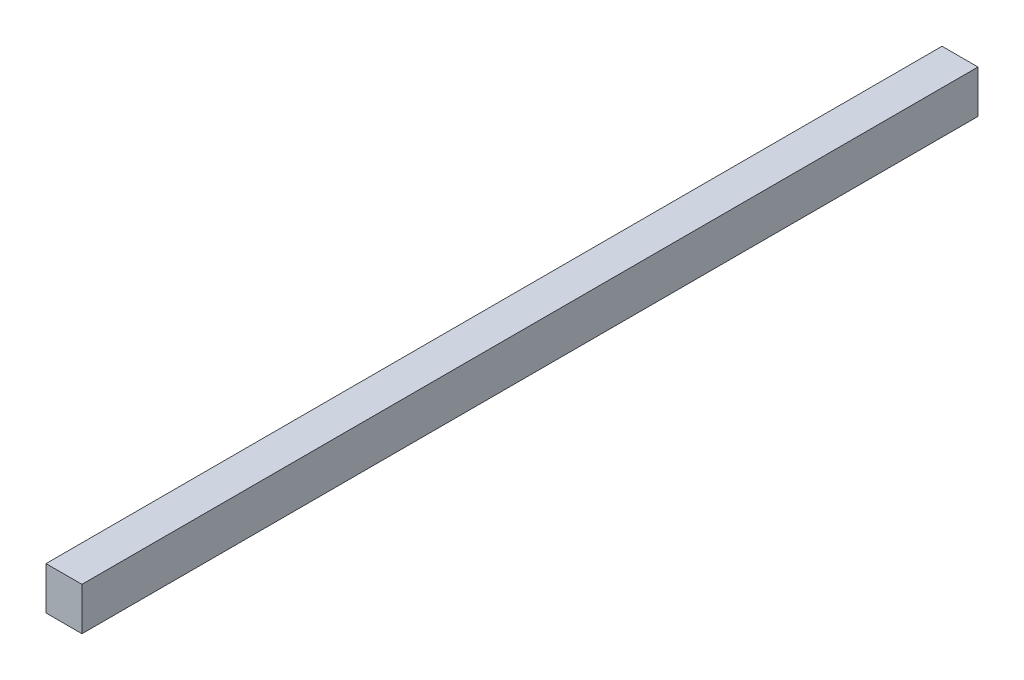
ISO-10303-21;
HEADER;
FILE_DESCRIPTION(('STEP AP214'),'2;1');
FILE_NAME('part.step','',(''),(''),'','','');
FILE_SCHEMA(('AUTOMOTIVE_DESIGN { 1 0 10303 214 1 1 1 1 }'));
ENDSEC;
DATA;
#1=APPLICATION_CONTEXT('core data for automotive mechanical design processes');
#2=APPLICATION_PROTOCOL_DEFINITION('international standard','automotive_design',2000,#1);
#3=PRODUCT_CONTEXT('',#1,'mechanical');
#4=PRODUCT('Part','Part','',(#3));
#5=PRODUCT_RELATED_PRODUCT_CATEGORY('part','',(#4));
#6=PRODUCT_DEFINITION_FORMATION('','',#4);
#7=PRODUCT_DEFINITION_CONTEXT('part definition',#1,'design');
#8=PRODUCT_DEFINITION('design','',#6,#7);
#9=PRODUCT_DEFINITION_SHAPE('','',#8);
#10=(LENGTH_UNIT() NAMED_UNIT(*) SI_UNIT(.MILLI.,.METRE.));
#11=(NAMED_UNIT(*) PLANE_ANGLE_UNIT() SI_UNIT($,.RADIAN.));
#12=(NAMED_UNIT(*) SI_UNIT($,.STERADIAN.) SOLID_ANGLE_UNIT());
#13=UNCERTAINTY_MEASURE_WITH_UNIT(LENGTH_MEASURE(1.E-05),#10,'distance_accuracy_value','');
#14=(GEOMETRIC_REPRESENTATION_CONTEXT(3) GLOBAL_UNCERTAINTY_ASSIGNED_CONTEXT((#13)) GLOBAL_UNIT_ASSIGNED_CONTEXT((#10,
#11,#12)) REPRESENTATION_CONTEXT('',''));
#15=CARTESIAN_POINT('',(0.,0.,0.));
#16=DIRECTION('',(0.,0.,1.));
#17=DIRECTION('',(1.,0.,0.));
#18=AXIS2_PLACEMENT_3D('',#15,#16,#17);
#19=CARTESIAN_POINT('',(0.,0.,1570.));
#20=DIRECTION('',(1.,0.,0.));
#21=DIRECTION('',(0.,0.,-1.));
#22=AXIS2_PLACEMENT_3D('',#19,#20,#21);
#23=PLANE('',#22);
#24=DIRECTION('',(0.,-1.,0.));
#25=VECTOR('',#24,1.);
#26=CARTESIAN_POINT('',(0.,0.,0.));
#27=LINE('',#26,#25);
#28=CARTESIAN_POINT('',(0.,75.,0.));
#29=VERTEX_POINT('',#28);
#30=CARTESIAN_POINT('',(0.,0.,0.));
#31=VERTEX_POINT('',#30);
#32=EDGE_CURVE('E96',#29,#31,#27,.T.);
#33=ORIENTED_EDGE('',*,*,#32,.T.);
#34=DIRECTION('',(0.,0.,-1.));
#35=VECTOR('',#34,1.);
#36=CARTESIAN_POINT('',(0.,0.,1570.));
#37=LINE('',#36,#35);
#38=CARTESIAN_POINT('',(0.,0.,1570.));
#39=VERTEX_POINT('',#38);
#40=EDGE_CURVE('E11',#39,#31,#37,.T.);
#41=ORIENTED_EDGE('',*,*,#40,.F.);
#42=DIRECTION('',(0.,-1.,0.));
#43=VECTOR('',#42,1.);
#44=CARTESIAN_POINT('',(0.,0.,1570.));
#45=LINE('',#44,#43);
#46=CARTESIAN_POINT('',(0.,75.,1570.));
#47=VERTEX_POINT('',#46);
#48=EDGE_CURVE('E84',#47,#39,#45,.T.);
#49=ORIENTED_EDGE('',*,*,#48,.F.);
#50=DIRECTION('',(0.,0.,-1.));
#51=VECTOR('',#50,1.);
#52=CARTESIAN_POINT('',(0.,75.,1570.));
#53=LINE('',#52,#51);
#54=EDGE_CURVE('E92',#47,#29,#53,.T.);
#55=ORIENTED_EDGE('',*,*,#54,.T.);
#56=EDGE_LOOP('',(#33,#41,#49,#55));
#57=FACE_BOUND('',#56,.T.);
#58=ADVANCED_FACE('F33',(#57),#23,.F.);
#59=CARTESIAN_POINT('',(0.,0.,1570.));
#60=DIRECTION('',(0.,1.,0.));
#61=DIRECTION('',(0.,0.,1.));
#62=AXIS2_PLACEMENT_3D('',#59,#60,#61);
#63=PLANE('',#62);
#64=DIRECTION('',(1.,0.,0.));
#65=VECTOR('',#64,1.);
#66=CARTESIAN_POINT('',(0.,0.,0.));
#67=LINE('',#66,#65);
#68=CARTESIAN_POINT('',(63.,0.,0.));
#69=VERTEX_POINT('',#68);
#70=EDGE_CURVE('E88',#31,#69,#67,.T.);
#71=ORIENTED_EDGE('',*,*,#70,.T.);
#72=DIRECTION('',(0.,0.,-1.));
#73=VECTOR('',#72,1.);
#74=CARTESIAN_POINT('',(63.,0.,1570.));
#75=LINE('',#74,#73);
#76=CARTESIAN_POINT('',(63.,0.,1570.));
#77=VERTEX_POINT('',#76);
#78=EDGE_CURVE('E41',#77,#69,#75,.T.);
#79=ORIENTED_EDGE('',*,*,#78,.F.);
#80=DIRECTION('',(1.,0.,0.));
#81=VECTOR('',#80,1.);
#82=CARTESIAN_POINT('',(0.,0.,1570.));
#83=LINE('',#82,#81);
#84=EDGE_CURVE('E79',#39,#77,#83,.T.);
#85=ORIENTED_EDGE('',*,*,#84,.F.);
#86=ORIENTED_EDGE('',*,*,#40,.T.);
#87=EDGE_LOOP('',(#71,#79,#85,#86));
#88=FACE_BOUND('',#87,.T.);
#89=ADVANCED_FACE('F87',(#88),#63,.F.);
#90=CARTESIAN_POINT('',(63.,0.,1570.));
#91=DIRECTION('',(-1.,0.,0.));
#92=DIRECTION('',(0.,0.,1.));
#93=AXIS2_PLACEMENT_3D('',#90,#91,#92);
#94=PLANE('',#93);
#95=DIRECTION('',(0.,1.,0.));
#96=VECTOR('',#95,1.);
#97=CARTESIAN_POINT('',(63.,0.,0.));
#98=LINE('',#97,#96);
#99=CARTESIAN_POINT('',(63.,75.,0.));
#100=VERTEX_POINT('',#99);
#101=EDGE_CURVE('E66',#69,#100,#98,.T.);
#102=ORIENTED_EDGE('',*,*,#101,.T.);
#103=DIRECTION('',(0.,0.,-1.));
#104=VECTOR('',#103,1.);
#105=CARTESIAN_POINT('',(63.,75.,1570.));
#106=LINE('',#105,#104);
#107=CARTESIAN_POINT('',(63.,75.,1570.));
#108=VERTEX_POINT('',#107);
#109=EDGE_CURVE('E89',#108,#100,#106,.T.);
#110=ORIENTED_EDGE('',*,*,#109,.F.);
#111=DIRECTION('',(0.,1.,0.));
#112=VECTOR('',#111,1.);
#113=CARTESIAN_POINT('',(63.,0.,1570.));
#114=LINE('',#113,#112);
#115=EDGE_CURVE('E82',#77,#108,#114,.T.);
#116=ORIENTED_EDGE('',*,*,#115,.F.);
#117=ORIENTED_EDGE('',*,*,#78,.T.);
#118=EDGE_LOOP('',(#102,#110,#116,#117));
#119=FACE_BOUND('',#118,.T.);
#120=ADVANCED_FACE('F90',(#119),#94,.F.);
#121=CARTESIAN_POINT('',(0.,75.,1570.));
#122=DIRECTION('',(0.,-1.,0.));
#123=DIRECTION('',(0.,0.,-1.));
#124=AXIS2_PLACEMENT_3D('',#121,#122,#123);
#125=PLANE('',#124);
#126=DIRECTION('',(-1.,0.,0.));
#127=VECTOR('',#126,1.);
#128=CARTESIAN_POINT('',(0.,75.,0.));
#129=LINE('',#128,#127);
#130=EDGE_CURVE('E72',#100,#29,#129,.T.);
#131=ORIENTED_EDGE('',*,*,#130,.T.);
#132=ORIENTED_EDGE('',*,*,#54,.F.);
#133=DIRECTION('',(-1.,0.,0.));
#134=VECTOR('',#133,1.);
#135=CARTESIAN_POINT('',(0.,75.,1570.));
#136=LINE('',#135,#134);
#137=EDGE_CURVE('E49',#108,#47,#136,.T.);
#138=ORIENTED_EDGE('',*,*,#137,.F.);
#139=ORIENTED_EDGE('',*,*,#109,.T.);
#140=EDGE_LOOP('',(#131,#132,#138,#139));
#141=FACE_BOUND('',#140,.T.);
#142=ADVANCED_FACE('F103',(#141),#125,.F.);
#143=CARTESIAN_POINT('',(0.,0.,1570.));
#144=DIRECTION('',(0.,0.,-1.));
#145=DIRECTION('',(-1.,0.,0.));
#146=AXIS2_PLACEMENT_3D('',#143,#144,#145);
#147=PLANE('',#146);
#148=ORIENTED_EDGE('',*,*,#48,.T.);
#149=ORIENTED_EDGE('',*,*,#84,.T.);
#150=ORIENTED_EDGE('',*,*,#115,.T.);
#151=ORIENTED_EDGE('',*,*,#137,.T.);
#152=EDGE_LOOP('',(#148,#149,#150,#151));
#153=FACE_BOUND('',#152,.T.);
#154=ADVANCED_FACE('F80',(#153),#147,.F.);
#155=CARTESIAN_POINT('',(0.,0.,0.));
#156=DIRECTION('',(0.,0.,-1.));
#157=DIRECTION('',(-1.,0.,0.));
#158=AXIS2_PLACEMENT_3D('',#155,#156,#157);
#159=PLANE('',#158);
#160=ORIENTED_EDGE('',*,*,#32,.F.);
#161=ORIENTED_EDGE('',*,*,#130,.F.);
#162=ORIENTED_EDGE('',*,*,#101,.F.);
#163=ORIENTED_EDGE('',*,*,#70,.F.);
#164=EDGE_LOOP('',(#160,#161,#162,#163));
#165=FACE_BOUND('',#164,.T.);
#166=ADVANCED_FACE('F106',(#165),#159,.T.);
#167=CLOSED_SHELL('',(#58,#89,#120,#142,#154,#166));
#168=MANIFOLD_SOLID_BREP('B2',#167);
#169=ADVANCED_BREP_SHAPE_REPRESENTATION('',(#18,#168),#14);
#170=SHAPE_DEFINITION_REPRESENTATION(#9,#169);
ENDSEC;
END-ISO-10303-21;
